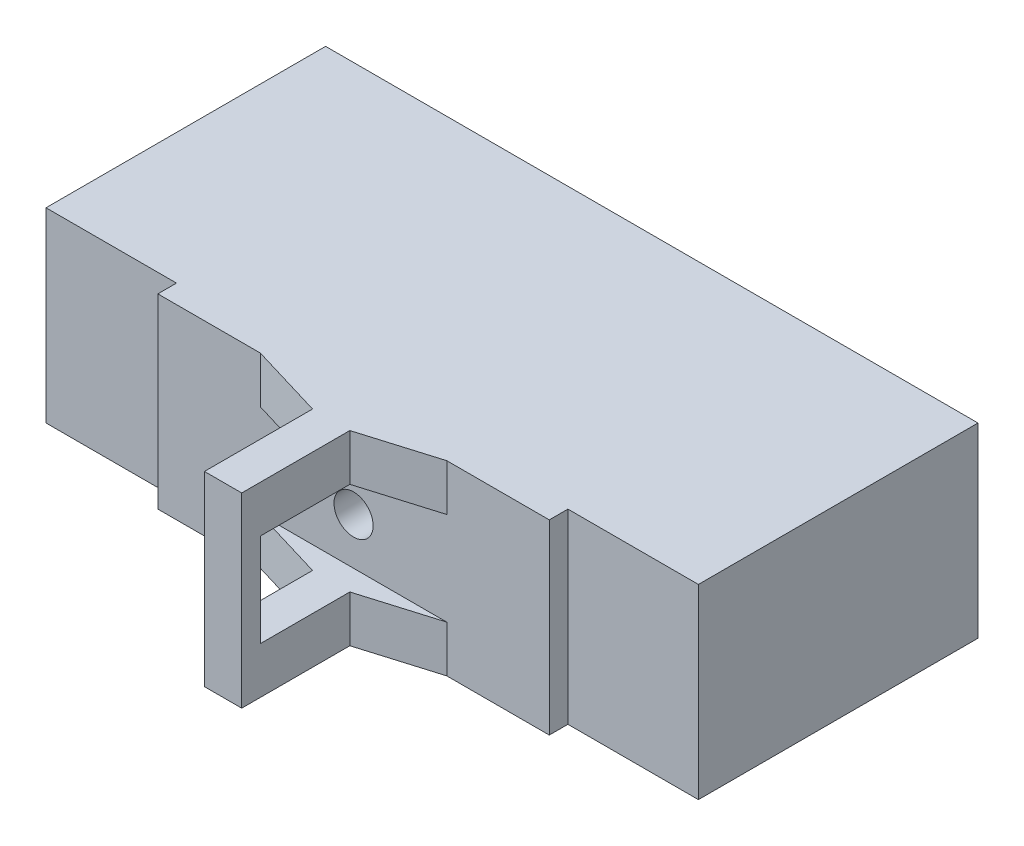
ISO-10303-21;
HEADER;
FILE_DESCRIPTION(('STEP AP214'),'2;1');
FILE_NAME('part.step','',(''),(''),'','','');
FILE_SCHEMA(('AUTOMOTIVE_DESIGN { 1 0 10303 214 1 1 1 1 }'));
ENDSEC;
DATA;
#1=APPLICATION_CONTEXT('core data for automotive mechanical design processes');
#2=APPLICATION_PROTOCOL_DEFINITION('international standard','automotive_design',2000,#1);
#3=PRODUCT_CONTEXT('',#1,'mechanical');
#4=PRODUCT('Part','Part','',(#3));
#5=PRODUCT_RELATED_PRODUCT_CATEGORY('part','',(#4));
#6=PRODUCT_DEFINITION_FORMATION('','',#4);
#7=PRODUCT_DEFINITION_CONTEXT('part definition',#1,'design');
#8=PRODUCT_DEFINITION('design','',#6,#7);
#9=PRODUCT_DEFINITION_SHAPE('','',#8);
#10=(LENGTH_UNIT() NAMED_UNIT(*) SI_UNIT(.MILLI.,.METRE.));
#11=(NAMED_UNIT(*) PLANE_ANGLE_UNIT() SI_UNIT($,.RADIAN.));
#12=(NAMED_UNIT(*) SI_UNIT($,.STERADIAN.) SOLID_ANGLE_UNIT());
#13=UNCERTAINTY_MEASURE_WITH_UNIT(LENGTH_MEASURE(1.E-05),#10,'distance_accuracy_value','');
#14=(GEOMETRIC_REPRESENTATION_CONTEXT(3) GLOBAL_UNCERTAINTY_ASSIGNED_CONTEXT((#13)) GLOBAL_UNIT_ASSIGNED_CONTEXT((#10,
#11,#12)) REPRESENTATION_CONTEXT('',''));
#15=CARTESIAN_POINT('',(0.,0.,0.));
#16=DIRECTION('',(0.,0.,1.));
#17=DIRECTION('',(1.,0.,0.));
#18=AXIS2_PLACEMENT_3D('',#15,#16,#17);
#19=CARTESIAN_POINT('',(31.,-4.44444444444445,44.));
#20=DIRECTION('',(0.,0.,1.));
#21=DIRECTION('',(1.,0.,0.));
#22=AXIS2_PLACEMENT_3D('',#19,#20,#21);
#23=PLANE('',#22);
#24=DIRECTION('',(-1.,0.,0.));
#25=VECTOR('',#24,1.);
#26=CARTESIAN_POINT('',(31.,-4.44444444444446,43.9999999999999));
#27=LINE('',#26,#25);
#28=CARTESIAN_POINT('',(8.00044444444444,-4.44444444444445,43.9999999999999));
#29=VERTEX_POINT('',#28);
#30=CARTESIAN_POINT('',(12.0004444444444,-4.44444444444445,43.9999999999999));
#31=VERTEX_POINT('',#30);
#32=EDGE_CURVE('E159',#29,#31,#27,.F.);
#33=ORIENTED_EDGE('',*,*,#32,.T.);
#34=DIRECTION('',(0.,1.,0.));
#35=VECTOR('',#34,1.);
#36=CARTESIAN_POINT('',(12.0004444444444,0.555555555555542,43.9999999999999));
#37=LINE('',#36,#35);
#38=CARTESIAN_POINT('',(12.0004444444444,-14.4444444444444,43.9999999999999));
#39=VERTEX_POINT('',#38);
#40=EDGE_CURVE('E162',#39,#31,#37,.T.);
#41=ORIENTED_EDGE('',*,*,#40,.F.);
#42=DIRECTION('',(1.,0.,0.));
#43=VECTOR('',#42,1.);
#44=CARTESIAN_POINT('',(31.,-14.4444444444444,43.9999999999999));
#45=LINE('',#44,#43);
#46=CARTESIAN_POINT('',(8.00044444444444,-14.4444444444444,43.9999999999999));
#47=VERTEX_POINT('',#46);
#48=EDGE_CURVE('E148',#39,#47,#45,.F.);
#49=ORIENTED_EDGE('',*,*,#48,.T.);
#50=DIRECTION('',(0.,1.,0.));
#51=VECTOR('',#50,1.);
#52=CARTESIAN_POINT('',(8.00044444444443,0.555555555555551,43.9999999999999));
#53=LINE('',#52,#51);
#54=EDGE_CURVE('E251',#29,#47,#53,.F.);
#55=ORIENTED_EDGE('',*,*,#54,.F.);
#56=EDGE_LOOP('',(#33,#41,#49,#55));
#57=FACE_BOUND('',#56,.T.);
#58=ADVANCED_FACE('F15',(#57),#23,.F.);
#59=CARTESIAN_POINT('',(31.,-14.4444444444444,44.));
#60=DIRECTION('',(0.,-1.,0.));
#61=DIRECTION('',(1.,0.,0.));
#62=AXIS2_PLACEMENT_3D('',#59,#60,#61);
#63=PLANE('',#62);
#64=DIRECTION('',(0.,0.,1.));
#65=VECTOR('',#64,1.);
#66=CARTESIAN_POINT('',(8.00044444444444,-14.4444444444444,32.));
#67=LINE('',#66,#65);
#68=CARTESIAN_POINT('',(8.00044444444444,-14.4444444444444,34.4001333333333));
#69=VERTEX_POINT('',#68);
#70=EDGE_CURVE('E155',#47,#69,#67,.F.);
#71=ORIENTED_EDGE('',*,*,#70,.F.);
#72=ORIENTED_EDGE('',*,*,#48,.F.);
#73=DIRECTION('',(0.,0.,-1.));
#74=VECTOR('',#73,1.);
#75=CARTESIAN_POINT('',(12.0004444444444,-14.4444444444444,46.));
#76=LINE('',#75,#74);
#77=CARTESIAN_POINT('',(12.0004444444444,-14.4444444444444,34.3998666666667));
#78=VERTEX_POINT('',#77);
#79=EDGE_CURVE('E152',#78,#39,#76,.F.);
#80=ORIENTED_EDGE('',*,*,#79,.F.);
#81=DIRECTION('',(0.957826285221152,0.,-0.287347885566345));
#82=VECTOR('',#81,1.);
#83=CARTESIAN_POINT('',(10.,-14.4444444444445,35.));
#84=LINE('',#83,#82);
#85=CARTESIAN_POINT('',(20.0000000000002,-14.4444444444444,32.));
#86=VERTEX_POINT('',#85);
#87=EDGE_CURVE('E172',#86,#78,#84,.F.);
#88=ORIENTED_EDGE('',*,*,#87,.F.);
#89=DIRECTION('',(1.,0.,0.));
#90=VECTOR('',#89,1.);
#91=CARTESIAN_POINT('',(10.,-14.4444444444444,32.));
#92=LINE('',#91,#90);
#93=CARTESIAN_POINT('',(-2.44484988277824E-13,-14.4444444444444,31.9999999999999));
#94=VERTEX_POINT('',#93);
#95=EDGE_CURVE('E240',#94,#86,#92,.T.);
#96=ORIENTED_EDGE('',*,*,#95,.F.);
#97=DIRECTION('',(0.957826285221152,0.,0.287347885566345));
#98=VECTOR('',#97,1.);
#99=CARTESIAN_POINT('',(0.,-14.4444444444444,32.));
#100=LINE('',#99,#98);
#101=EDGE_CURVE('E249',#69,#94,#100,.F.);
#102=ORIENTED_EDGE('',*,*,#101,.F.);
#103=EDGE_LOOP('',(#71,#72,#80,#88,#96,#102));
#104=FACE_BOUND('',#103,.T.);
#105=ADVANCED_FACE('F150',(#104),#63,.F.);
#106=CARTESIAN_POINT('',(10.,0.555555555555551,35.));
#107=DIRECTION('',(0.287347885566345,0.,0.957826285221152));
#108=DIRECTION('',(0.957826285221152,0.,-0.287347885566345));
#109=AXIS2_PLACEMENT_3D('',#106,#107,#108);
#110=PLANE('',#109);
#111=DIRECTION('',(0.957826285221151,0.,-0.287347885566348));
#112=VECTOR('',#111,1.);
#113=CARTESIAN_POINT('',(12.0004444444444,0.555555555555551,34.3998666666667));
#114=LINE('',#113,#112);
#115=CARTESIAN_POINT('',(12.0004444444444,0.555555555555551,34.3998666666667));
#116=VERTEX_POINT('',#115);
#117=CARTESIAN_POINT('',(20.,0.555555555555551,32.));
#118=VERTEX_POINT('',#117);
#119=EDGE_CURVE('E185',#116,#118,#114,.T.);
#120=ORIENTED_EDGE('',*,*,#119,.F.);
#121=DIRECTION('',(0.,1.,0.));
#122=VECTOR('',#121,1.);
#123=CARTESIAN_POINT('',(12.0004444444444,0.555555555555542,34.3998666666667));
#124=LINE('',#123,#122);
#125=CARTESIAN_POINT('',(12.0004444444444,-4.44444444444445,34.3998666666667));
#126=VERTEX_POINT('',#125);
#127=EDGE_CURVE('E274',#126,#116,#124,.T.);
#128=ORIENTED_EDGE('',*,*,#127,.F.);
#129=DIRECTION('',(0.957826285221152,0.,-0.287347885566344));
#130=VECTOR('',#129,1.);
#131=CARTESIAN_POINT('',(12.0004444444444,-4.44444444444445,34.3998666666667));
#132=LINE('',#131,#130);
#133=CARTESIAN_POINT('',(20.0000000000001,-4.44444444444445,32.));
#134=VERTEX_POINT('',#133);
#135=EDGE_CURVE('E191',#126,#134,#132,.T.);
#136=ORIENTED_EDGE('',*,*,#135,.T.);
#137=DIRECTION('',(0.,1.,0.));
#138=VECTOR('',#137,1.);
#139=CARTESIAN_POINT('',(20.,-9.44444444444445,32.));
#140=LINE('',#139,#138);
#141=EDGE_CURVE('E229',#118,#134,#140,.F.);
#142=ORIENTED_EDGE('',*,*,#141,.F.);
#143=EDGE_LOOP('',(#120,#128,#136,#142));
#144=FACE_BOUND('',#143,.T.);
#145=ADVANCED_FACE('F283',(#144),#110,.T.);
#146=CARTESIAN_POINT('',(31.,-4.44444444444446,32.));
#147=DIRECTION('',(0.,1.,0.));
#148=DIRECTION('',(-1.,0.,0.));
#149=AXIS2_PLACEMENT_3D('',#146,#147,#148);
#150=PLANE('',#149);
#151=DIRECTION('',(1.,0.,0.));
#152=VECTOR('',#151,1.);
#153=CARTESIAN_POINT('',(10.,-4.44444444444445,32.));
#154=LINE('',#153,#152);
#155=CARTESIAN_POINT('',(0.,-4.44444444444445,32.));
#156=VERTEX_POINT('',#155);
#157=EDGE_CURVE('E226',#134,#156,#154,.F.);
#158=ORIENTED_EDGE('',*,*,#157,.F.);
#159=ORIENTED_EDGE('',*,*,#135,.F.);
#160=DIRECTION('',(0.,0.,-1.));
#161=VECTOR('',#160,1.);
#162=CARTESIAN_POINT('',(12.0004444444444,-4.44444444444445,46.));
#163=LINE('',#162,#161);
#164=EDGE_CURVE('E166',#31,#126,#163,.T.);
#165=ORIENTED_EDGE('',*,*,#164,.F.);
#166=ORIENTED_EDGE('',*,*,#32,.F.);
#167=DIRECTION('',(0.,0.,1.));
#168=VECTOR('',#167,1.);
#169=CARTESIAN_POINT('',(8.00044444444444,-4.44444444444445,32.));
#170=LINE('',#169,#168);
#171=CARTESIAN_POINT('',(8.00044444444444,-4.44444444444445,34.4001333333333));
#172=VERTEX_POINT('',#171);
#173=EDGE_CURVE('E253',#172,#29,#170,.T.);
#174=ORIENTED_EDGE('',*,*,#173,.F.);
#175=DIRECTION('',(0.957826285221152,0.,0.287347885566345));
#176=VECTOR('',#175,1.);
#177=CARTESIAN_POINT('',(0.,-4.44444444444445,32.));
#178=LINE('',#177,#176);
#179=EDGE_CURVE('E189',#156,#172,#178,.T.);
#180=ORIENTED_EDGE('',*,*,#179,.F.);
#181=EDGE_LOOP('',(#158,#159,#165,#166,#174,#180));
#182=FACE_BOUND('',#181,.T.);
#183=ADVANCED_FACE('F279',(#182),#150,.F.);
#184=CARTESIAN_POINT('',(0.,0.555555555555551,32.));
#185=DIRECTION('',(-0.287347885566345,0.,0.957826285221152));
#186=DIRECTION('',(0.957826285221152,0.,0.287347885566345));
#187=AXIS2_PLACEMENT_3D('',#184,#185,#186);
#188=PLANE('',#187);
#189=DIRECTION('',(0.957826285221152,0.,0.287347885566343));
#190=VECTOR('',#189,1.);
#191=CARTESIAN_POINT('',(0.,0.555555555555551,32.));
#192=LINE('',#191,#190);
#193=CARTESIAN_POINT('',(0.,0.555555555555546,32.));
#194=VERTEX_POINT('',#193);
#195=CARTESIAN_POINT('',(8.00044444444444,0.555555555555547,34.4001333333333));
#196=VERTEX_POINT('',#195);
#197=EDGE_CURVE('E187',#194,#196,#192,.T.);
#198=ORIENTED_EDGE('',*,*,#197,.F.);
#199=DIRECTION('',(0.,1.,0.));
#200=VECTOR('',#199,1.);
#201=CARTESIAN_POINT('',(-3.38271077815477E-13,-9.44444444444445,32.));
#202=LINE('',#201,#200);
#203=EDGE_CURVE('E223',#156,#194,#202,.T.);
#204=ORIENTED_EDGE('',*,*,#203,.F.);
#205=ORIENTED_EDGE('',*,*,#179,.T.);
#206=DIRECTION('',(0.,1.,0.));
#207=VECTOR('',#206,1.);
#208=CARTESIAN_POINT('',(8.00044444444444,0.555555555555551,34.4001333333333));
#209=LINE('',#208,#207);
#210=EDGE_CURVE('E256',#196,#172,#209,.F.);
#211=ORIENTED_EDGE('',*,*,#210,.F.);
#212=EDGE_LOOP('',(#198,#204,#205,#211));
#213=FACE_BOUND('',#212,.T.);
#214=ADVANCED_FACE('F587',(#213),#188,.T.);
#215=CARTESIAN_POINT('',(10.,-9.44444444444445,0.));
#216=DIRECTION('',(0.,0.,1.));
#217=DIRECTION('',(0.,-1.,0.));
#218=AXIS2_PLACEMENT_3D('',#215,#216,#217);
#219=CYLINDRICAL_SURFACE('',#218,2.1);
#220=CARTESIAN_POINT('',(10.,-9.44444444444433,32.));
#221=DIRECTION('',(0.,0.,1.));
#222=DIRECTION('',(0.,-1.,0.));
#223=AXIS2_PLACEMENT_3D('',#220,#221,#222);
#224=CIRCLE('',#223,2.1);
#225=CARTESIAN_POINT('',(10.,-11.5444444444443,32.));
#226=VERTEX_POINT('',#225);
#227=EDGE_CURVE('E18',#226,#226,#224,.F.);
#228=ORIENTED_EDGE('',*,*,#227,.F.);
#229=EDGE_LOOP('',(#228));
#230=FACE_BOUND('',#229,.T.);
#231=CARTESIAN_POINT('',(10.,-9.44444444444445,0.));
#232=DIRECTION('',(0.,0.,1.));
#233=DIRECTION('',(0.,-1.,0.));
#234=AXIS2_PLACEMENT_3D('',#231,#232,#233);
#235=CIRCLE('',#234,2.1);
#236=CARTESIAN_POINT('',(10.,-11.5444444444445,0.));
#237=VERTEX_POINT('',#236);
#238=EDGE_CURVE('E193',#237,#237,#235,.F.);
#239=ORIENTED_EDGE('',*,*,#238,.T.);
#240=EDGE_LOOP('',(#239));
#241=FACE_BOUND('',#240,.T.);
#242=ADVANCED_FACE('F498',(#230,#241),#219,.F.);
#243=CARTESIAN_POINT('',(-25.,0.555555555555551,0.));
#244=DIRECTION('',(0.,1.,0.));
#245=DIRECTION('',(0.,0.,1.));
#246=AXIS2_PLACEMENT_3D('',#243,#244,#245);
#247=PLANE('',#246);
#248=DIRECTION('',(1.,0.,0.));
#249=VECTOR('',#248,1.);
#250=CARTESIAN_POINT('',(10.,0.55555555555555,0.));
#251=LINE('',#250,#249);
#252=CARTESIAN_POINT('',(45.,0.555555555555551,0.));
#253=VERTEX_POINT('',#252);
#254=CARTESIAN_POINT('',(-25.,0.555555555555551,0.));
#255=VERTEX_POINT('',#254);
#256=EDGE_CURVE('E195',#253,#255,#251,.F.);
#257=ORIENTED_EDGE('',*,*,#256,.T.);
#258=DIRECTION('',(0.,0.,1.));
#259=VECTOR('',#258,1.);
#260=CARTESIAN_POINT('',(-25.,0.555555555555552,0.));
#261=LINE('',#260,#259);
#262=CARTESIAN_POINT('',(-25.,0.555555555555551,30.));
#263=VERTEX_POINT('',#262);
#264=EDGE_CURVE('E196',#263,#255,#261,.F.);
#265=ORIENTED_EDGE('',*,*,#264,.F.);
#266=DIRECTION('',(1.,0.,0.));
#267=VECTOR('',#266,1.);
#268=CARTESIAN_POINT('',(10.,0.55555555555555,30.));
#269=LINE('',#268,#267);
#270=CARTESIAN_POINT('',(-11.,0.555555555555551,30.));
#271=VERTEX_POINT('',#270);
#272=EDGE_CURVE('E208',#271,#263,#269,.F.);
#273=ORIENTED_EDGE('',*,*,#272,.F.);
#274=DIRECTION('',(0.,0.,1.));
#275=VECTOR('',#274,1.);
#276=CARTESIAN_POINT('',(-11.,0.555555555555552,30.));
#277=LINE('',#276,#275);
#278=CARTESIAN_POINT('',(-11.,0.555555555555551,32.));
#279=VERTEX_POINT('',#278);
#280=EDGE_CURVE('E216',#279,#271,#277,.F.);
#281=ORIENTED_EDGE('',*,*,#280,.F.);
#282=DIRECTION('',(1.,0.,0.));
#283=VECTOR('',#282,1.);
#284=CARTESIAN_POINT('',(10.,0.55555555555555,32.));
#285=LINE('',#284,#283);
#286=EDGE_CURVE('E221',#194,#279,#285,.F.);
#287=ORIENTED_EDGE('',*,*,#286,.F.);
#288=ORIENTED_EDGE('',*,*,#197,.T.);
#289=DIRECTION('',(0.,0.,1.));
#290=VECTOR('',#289,1.);
#291=CARTESIAN_POINT('',(8.00044444444444,0.555555555555542,32.));
#292=LINE('',#291,#290);
#293=CARTESIAN_POINT('',(8.00044444444444,0.555555555555544,46.));
#294=VERTEX_POINT('',#293);
#295=EDGE_CURVE('E259',#294,#196,#292,.F.);
#296=ORIENTED_EDGE('',*,*,#295,.F.);
#297=DIRECTION('',(1.,0.,0.));
#298=VECTOR('',#297,1.);
#299=CARTESIAN_POINT('',(8.00044444444444,0.555555555555542,46.));
#300=LINE('',#299,#298);
#301=CARTESIAN_POINT('',(12.0004444444444,0.555555555555549,46.));
#302=VERTEX_POINT('',#301);
#303=EDGE_CURVE('E266',#302,#294,#300,.F.);
#304=ORIENTED_EDGE('',*,*,#303,.F.);
#305=DIRECTION('',(0.,0.,-1.));
#306=VECTOR('',#305,1.);
#307=CARTESIAN_POINT('',(12.0004444444444,0.555555555555551,46.));
#308=LINE('',#307,#306);
#309=EDGE_CURVE('E272',#116,#302,#308,.F.);
#310=ORIENTED_EDGE('',*,*,#309,.F.);
#311=ORIENTED_EDGE('',*,*,#119,.T.);
#312=DIRECTION('',(1.,0.,0.));
#313=VECTOR('',#312,1.);
#314=CARTESIAN_POINT('',(10.,0.55555555555555,32.));
#315=LINE('',#314,#313);
#316=CARTESIAN_POINT('',(31.,0.555555555555551,32.));
#317=VERTEX_POINT('',#316);
#318=EDGE_CURVE('E232',#317,#118,#315,.F.);
#319=ORIENTED_EDGE('',*,*,#318,.F.);
#320=DIRECTION('',(0.,0.,-1.));
#321=VECTOR('',#320,1.);
#322=CARTESIAN_POINT('',(31.,0.555555555555551,30.));
#323=LINE('',#322,#321);
#324=CARTESIAN_POINT('',(31.,0.555555555555551,30.));
#325=VERTEX_POINT('',#324);
#326=EDGE_CURVE('E174',#325,#317,#323,.F.);
#327=ORIENTED_EDGE('',*,*,#326,.F.);
#328=DIRECTION('',(1.,0.,0.));
#329=VECTOR('',#328,1.);
#330=CARTESIAN_POINT('',(10.,0.55555555555555,30.));
#331=LINE('',#330,#329);
#332=CARTESIAN_POINT('',(45.,0.555555555555551,30.));
#333=VERTEX_POINT('',#332);
#334=EDGE_CURVE('E182',#333,#325,#331,.F.);
#335=ORIENTED_EDGE('',*,*,#334,.F.);
#336=DIRECTION('',(0.,0.,-1.));
#337=VECTOR('',#336,1.);
#338=CARTESIAN_POINT('',(45.,0.555555555555551,0.));
#339=LINE('',#338,#337);
#340=EDGE_CURVE('E320',#253,#333,#339,.F.);
#341=ORIENTED_EDGE('',*,*,#340,.F.);
#342=EDGE_LOOP('',(#257,#265,#273,#281,#287,#288,#296,#304,#310,#311,#319,#327,#335,#341));
#343=FACE_BOUND('',#342,.T.);
#344=ADVANCED_FACE('F288',(#343),#247,.T.);
#345=CARTESIAN_POINT('',(10.,-9.44444444444445,30.));
#346=DIRECTION('',(0.,0.,1.));
#347=DIRECTION('',(1.,0.,0.));
#348=AXIS2_PLACEMENT_3D('',#345,#346,#347);
#349=PLANE('',#348);
#350=DIRECTION('',(0.,1.,0.));
#351=VECTOR('',#350,1.);
#352=CARTESIAN_POINT('',(45.,0.555555555555551,30.));
#353=LINE('',#352,#351);
#354=CARTESIAN_POINT('',(45.,-19.4444444444444,30.));
#355=VERTEX_POINT('',#354);
#356=EDGE_CURVE('E324',#333,#355,#353,.F.);
#357=ORIENTED_EDGE('',*,*,#356,.F.);
#358=ORIENTED_EDGE('',*,*,#334,.T.);
#359=DIRECTION('',(0.,1.,0.));
#360=VECTOR('',#359,1.);
#361=CARTESIAN_POINT('',(31.,0.555555555555551,30.));
#362=LINE('',#361,#360);
#363=CARTESIAN_POINT('',(31.,-19.4444444444444,30.));
#364=VERTEX_POINT('',#363);
#365=EDGE_CURVE('E179',#364,#325,#362,.T.);
#366=ORIENTED_EDGE('',*,*,#365,.F.);
#367=DIRECTION('',(1.,0.,0.));
#368=VECTOR('',#367,1.);
#369=CARTESIAN_POINT('',(45.,-19.4444444444445,30.));
#370=LINE('',#369,#368);
#371=EDGE_CURVE('E317',#355,#364,#370,.F.);
#372=ORIENTED_EDGE('',*,*,#371,.F.);
#373=EDGE_LOOP('',(#357,#358,#366,#372));
#374=FACE_BOUND('',#373,.T.);
#375=ADVANCED_FACE('F371',(#374),#349,.T.);
#376=CARTESIAN_POINT('',(31.,0.555555555555551,30.));
#377=DIRECTION('',(1.,0.,0.));
#378=DIRECTION('',(0.,0.,-1.));
#379=AXIS2_PLACEMENT_3D('',#376,#377,#378);
#380=PLANE('',#379);
#381=ORIENTED_EDGE('',*,*,#365,.T.);
#382=ORIENTED_EDGE('',*,*,#326,.T.);
#383=DIRECTION('',(0.,1.,0.));
#384=VECTOR('',#383,1.);
#385=CARTESIAN_POINT('',(31.,-9.44444444444445,32.));
#386=LINE('',#385,#384);
#387=CARTESIAN_POINT('',(31.,-19.4444444444444,32.));
#388=VERTEX_POINT('',#387);
#389=EDGE_CURVE('E235',#388,#317,#386,.T.);
#390=ORIENTED_EDGE('',*,*,#389,.F.);
#391=DIRECTION('',(0.,0.,-1.));
#392=VECTOR('',#391,1.);
#393=CARTESIAN_POINT('',(31.,-19.4444444444445,0.));
#394=LINE('',#393,#392);
#395=EDGE_CURVE('E314',#364,#388,#394,.F.);
#396=ORIENTED_EDGE('',*,*,#395,.F.);
#397=EDGE_LOOP('',(#381,#382,#390,#396));
#398=FACE_BOUND('',#397,.T.);
#399=ADVANCED_FACE('F373',(#398),#380,.T.);
#400=CARTESIAN_POINT('',(10.,0.555555555555551,35.));
#401=DIRECTION('',(0.287347885566345,0.,0.957826285221152));
#402=DIRECTION('',(0.957826285221152,0.,-0.287347885566345));
#403=AXIS2_PLACEMENT_3D('',#400,#401,#402);
#404=PLANE('',#403);
#405=DIRECTION('',(-0.957826285221151,0.,0.287347885566348));
#406=VECTOR('',#405,1.);
#407=CARTESIAN_POINT('',(20.,-19.4444444444445,32.));
#408=LINE('',#407,#406);
#409=CARTESIAN_POINT('',(20.0000000000001,-19.4444444444445,32.));
#410=VERTEX_POINT('',#409);
#411=CARTESIAN_POINT('',(12.0004444444444,-19.4444444444445,34.3998666666667));
#412=VERTEX_POINT('',#411);
#413=EDGE_CURVE('E307',#410,#412,#408,.T.);
#414=ORIENTED_EDGE('',*,*,#413,.F.);
#415=DIRECTION('',(0.,1.,0.));
#416=VECTOR('',#415,1.);
#417=CARTESIAN_POINT('',(20.0000000000001,-9.44444444444445,32.));
#418=LINE('',#417,#416);
#419=EDGE_CURVE('E238',#86,#410,#418,.F.);
#420=ORIENTED_EDGE('',*,*,#419,.F.);
#421=ORIENTED_EDGE('',*,*,#87,.T.);
#422=DIRECTION('',(0.,1.,0.));
#423=VECTOR('',#422,1.);
#424=CARTESIAN_POINT('',(12.0004444444444,0.555555555555542,34.3998666666667));
#425=LINE('',#424,#423);
#426=EDGE_CURVE('E171',#412,#78,#425,.T.);
#427=ORIENTED_EDGE('',*,*,#426,.F.);
#428=EDGE_LOOP('',(#414,#420,#421,#427));
#429=FACE_BOUND('',#428,.T.);
#430=ADVANCED_FACE('F377',(#429),#404,.T.);
#431=CARTESIAN_POINT('',(12.0004444444444,0.555555555555542,46.));
#432=DIRECTION('',(1.,0.,0.));
#433=DIRECTION('',(0.,0.,-1.));
#434=AXIS2_PLACEMENT_3D('',#431,#432,#433);
#435=PLANE('',#434);
#436=DIRECTION('',(0.,0.,-1.));
#437=VECTOR('',#436,1.);
#438=CARTESIAN_POINT('',(12.0004444444444,-19.4444444444445,0.));
#439=LINE('',#438,#437);
#440=CARTESIAN_POINT('',(12.0004444444444,-19.4444444444445,46.));
#441=VERTEX_POINT('',#440);
#442=EDGE_CURVE('E292',#412,#441,#439,.F.);
#443=ORIENTED_EDGE('',*,*,#442,.F.);
#444=ORIENTED_EDGE('',*,*,#426,.T.);
#445=ORIENTED_EDGE('',*,*,#79,.T.);
#446=ORIENTED_EDGE('',*,*,#40,.T.);
#447=ORIENTED_EDGE('',*,*,#164,.T.);
#448=ORIENTED_EDGE('',*,*,#127,.T.);
#449=ORIENTED_EDGE('',*,*,#309,.T.);
#450=DIRECTION('',(0.,-1.,0.));
#451=VECTOR('',#450,1.);
#452=CARTESIAN_POINT('',(12.0004444444444,0.555555555555542,46.));
#453=LINE('',#452,#451);
#454=EDGE_CURVE('E268',#441,#302,#453,.F.);
#455=ORIENTED_EDGE('',*,*,#454,.F.);
#456=EDGE_LOOP('',(#443,#444,#445,#446,#447,#448,#449,#455));
#457=FACE_BOUND('',#456,.T.);
#458=ADVANCED_FACE('F170',(#457),#435,.T.);
#459=CARTESIAN_POINT('',(8.00044444444444,0.555555555555542,46.));
#460=DIRECTION('',(0.,0.,1.));
#461=DIRECTION('',(0.,-1.,0.));
#462=AXIS2_PLACEMENT_3D('',#459,#460,#461);
#463=PLANE('',#462);
#464=ORIENTED_EDGE('',*,*,#303,.T.);
#465=DIRECTION('',(0.,1.,0.));
#466=VECTOR('',#465,1.);
#467=CARTESIAN_POINT('',(8.00044444444443,0.555555555555551,46.));
#468=LINE('',#467,#466);
#469=CARTESIAN_POINT('',(8.00044444444444,-19.4444444444445,46.));
#470=VERTEX_POINT('',#469);
#471=EDGE_CURVE('E262',#470,#294,#468,.T.);
#472=ORIENTED_EDGE('',*,*,#471,.F.);
#473=DIRECTION('',(1.,0.,0.));
#474=VECTOR('',#473,1.);
#475=CARTESIAN_POINT('',(45.,-19.4444444444445,46.));
#476=LINE('',#475,#474);
#477=EDGE_CURVE('E296',#441,#470,#476,.F.);
#478=ORIENTED_EDGE('',*,*,#477,.F.);
#479=ORIENTED_EDGE('',*,*,#454,.T.);
#480=EDGE_LOOP('',(#464,#472,#478,#479));
#481=FACE_BOUND('',#480,.T.);
#482=ADVANCED_FACE('F297',(#481),#463,.T.);
#483=CARTESIAN_POINT('',(8.00044444444444,0.555555555555551,32.));
#484=DIRECTION('',(-1.,0.,0.));
#485=DIRECTION('',(0.,0.,1.));
#486=AXIS2_PLACEMENT_3D('',#483,#484,#485);
#487=PLANE('',#486);
#488=ORIENTED_EDGE('',*,*,#173,.T.);
#489=ORIENTED_EDGE('',*,*,#54,.T.);
#490=ORIENTED_EDGE('',*,*,#70,.T.);
#491=DIRECTION('',(0.,1.,0.));
#492=VECTOR('',#491,1.);
#493=CARTESIAN_POINT('',(8.00044444444444,0.555555555555551,34.4001333333333));
#494=LINE('',#493,#492);
#495=CARTESIAN_POINT('',(8.00044444444444,-19.4444444444445,34.4001333333333));
#496=VERTEX_POINT('',#495);
#497=EDGE_CURVE('E246',#496,#69,#494,.T.);
#498=ORIENTED_EDGE('',*,*,#497,.F.);
#499=DIRECTION('',(0.,0.,-1.));
#500=VECTOR('',#499,1.);
#501=CARTESIAN_POINT('',(8.00044444444445,-19.4444444444445,0.));
#502=LINE('',#501,#500);
#503=EDGE_CURVE('E301',#470,#496,#502,.T.);
#504=ORIENTED_EDGE('',*,*,#503,.F.);
#505=ORIENTED_EDGE('',*,*,#471,.T.);
#506=ORIENTED_EDGE('',*,*,#295,.T.);
#507=ORIENTED_EDGE('',*,*,#210,.T.);
#508=EDGE_LOOP('',(#488,#489,#490,#498,#504,#505,#506,#507));
#509=FACE_BOUND('',#508,.T.);
#510=ADVANCED_FACE('F349',(#509),#487,.T.);
#511=CARTESIAN_POINT('',(0.,0.555555555555551,32.));
#512=DIRECTION('',(-0.287347885566345,0.,0.957826285221152));
#513=DIRECTION('',(0.957826285221152,0.,0.287347885566345));
#514=AXIS2_PLACEMENT_3D('',#511,#512,#513);
#515=PLANE('',#514);
#516=DIRECTION('',(-0.957826285221152,0.,-0.287347885566343));
#517=VECTOR('',#516,1.);
#518=CARTESIAN_POINT('',(8.00044444444445,-19.4444444444445,34.4001333333333));
#519=LINE('',#518,#517);
#520=CARTESIAN_POINT('',(-1.66956222055457E-13,-19.4444444444445,31.9999999999999));
#521=VERTEX_POINT('',#520);
#522=EDGE_CURVE('E345',#496,#521,#519,.T.);
#523=ORIENTED_EDGE('',*,*,#522,.F.);
#524=ORIENTED_EDGE('',*,*,#497,.T.);
#525=ORIENTED_EDGE('',*,*,#101,.T.);
#526=DIRECTION('',(0.,1.,0.));
#527=VECTOR('',#526,1.);
#528=CARTESIAN_POINT('',(0.,-9.44444444444445,32.));
#529=LINE('',#528,#527);
#530=EDGE_CURVE('E243',#521,#94,#529,.T.);
#531=ORIENTED_EDGE('',*,*,#530,.F.);
#532=EDGE_LOOP('',(#523,#524,#525,#531));
#533=FACE_BOUND('',#532,.T.);
#534=ADVANCED_FACE('F351',(#533),#515,.T.);
#535=CARTESIAN_POINT('',(10.,-9.44444444444445,32.));
#536=DIRECTION('',(0.,0.,1.));
#537=DIRECTION('',(1.,0.,0.));
#538=AXIS2_PLACEMENT_3D('',#535,#536,#537);
#539=PLANE('',#538);
#540=ORIENTED_EDGE('',*,*,#203,.T.);
#541=ORIENTED_EDGE('',*,*,#286,.T.);
#542=DIRECTION('',(0.,1.,0.));
#543=VECTOR('',#542,1.);
#544=CARTESIAN_POINT('',(-11.,-19.4444444444444,32.));
#545=LINE('',#544,#543);
#546=CARTESIAN_POINT('',(-11.,-19.4444444444444,32.));
#547=VERTEX_POINT('',#546);
#548=EDGE_CURVE('E218',#547,#279,#545,.T.);
#549=ORIENTED_EDGE('',*,*,#548,.F.);
#550=DIRECTION('',(1.,0.,0.));
#551=VECTOR('',#550,1.);
#552=CARTESIAN_POINT('',(45.,-19.4444444444445,32.));
#553=LINE('',#552,#551);
#554=EDGE_CURVE('E342',#521,#547,#553,.F.);
#555=ORIENTED_EDGE('',*,*,#554,.F.);
#556=ORIENTED_EDGE('',*,*,#530,.T.);
#557=ORIENTED_EDGE('',*,*,#95,.T.);
#558=ORIENTED_EDGE('',*,*,#419,.T.);
#559=DIRECTION('',(1.,0.,0.));
#560=VECTOR('',#559,1.);
#561=CARTESIAN_POINT('',(45.,-19.4444444444445,32.));
#562=LINE('',#561,#560);
#563=EDGE_CURVE('E309',#388,#410,#562,.F.);
#564=ORIENTED_EDGE('',*,*,#563,.F.);
#565=ORIENTED_EDGE('',*,*,#389,.T.);
#566=ORIENTED_EDGE('',*,*,#318,.T.);
#567=ORIENTED_EDGE('',*,*,#141,.T.);
#568=ORIENTED_EDGE('',*,*,#157,.T.);
#569=EDGE_LOOP('',(#540,#541,#549,#555,#556,#557,#558,#564,#565,#566,#567,#568));
#570=FACE_BOUND('',#569,.T.);
#571=ORIENTED_EDGE('',*,*,#227,.T.);
#572=EDGE_LOOP('',(#571));
#573=FACE_BOUND('',#572,.T.);
#574=ADVANCED_FACE('F355',(#570,#573),#539,.T.);
#575=CARTESIAN_POINT('',(-11.,-19.4444444444444,30.));
#576=DIRECTION('',(-1.,0.,0.));
#577=DIRECTION('',(0.,0.,1.));
#578=AXIS2_PLACEMENT_3D('',#575,#576,#577);
#579=PLANE('',#578);
#580=DIRECTION('',(0.,1.,0.));
#581=VECTOR('',#580,1.);
#582=CARTESIAN_POINT('',(-11.,-9.44444444444445,30.));
#583=LINE('',#582,#581);
#584=CARTESIAN_POINT('',(-11.,-19.4444444444444,30.));
#585=VERTEX_POINT('',#584);
#586=EDGE_CURVE('E213',#585,#271,#583,.T.);
#587=ORIENTED_EDGE('',*,*,#586,.F.);
#588=DIRECTION('',(0.,0.,-1.));
#589=VECTOR('',#588,1.);
#590=CARTESIAN_POINT('',(-11.,-19.4444444444445,0.));
#591=LINE('',#590,#589);
#592=EDGE_CURVE('E338',#547,#585,#591,.T.);
#593=ORIENTED_EDGE('',*,*,#592,.F.);
#594=ORIENTED_EDGE('',*,*,#548,.T.);
#595=ORIENTED_EDGE('',*,*,#280,.T.);
#596=EDGE_LOOP('',(#587,#593,#594,#595));
#597=FACE_BOUND('',#596,.T.);
#598=ADVANCED_FACE('F359',(#597),#579,.T.);
#599=CARTESIAN_POINT('',(10.,-9.44444444444445,30.));
#600=DIRECTION('',(0.,0.,1.));
#601=DIRECTION('',(1.,0.,0.));
#602=AXIS2_PLACEMENT_3D('',#599,#600,#601);
#603=PLANE('',#602);
#604=DIRECTION('',(0.,1.,0.));
#605=VECTOR('',#604,1.);
#606=CARTESIAN_POINT('',(-25.,-19.4444444444445,30.));
#607=LINE('',#606,#605);
#608=CARTESIAN_POINT('',(-25.,-19.4444444444445,30.));
#609=VERTEX_POINT('',#608);
#610=EDGE_CURVE('E202',#609,#263,#607,.T.);
#611=ORIENTED_EDGE('',*,*,#610,.F.);
#612=DIRECTION('',(1.,0.,0.));
#613=VECTOR('',#612,1.);
#614=CARTESIAN_POINT('',(45.,-19.4444444444445,30.));
#615=LINE('',#614,#613);
#616=EDGE_CURVE('E336',#585,#609,#615,.F.);
#617=ORIENTED_EDGE('',*,*,#616,.F.);
#618=ORIENTED_EDGE('',*,*,#586,.T.);
#619=ORIENTED_EDGE('',*,*,#272,.T.);
#620=EDGE_LOOP('',(#611,#617,#618,#619));
#621=FACE_BOUND('',#620,.T.);
#622=ADVANCED_FACE('F363',(#621),#603,.T.);
#623=CARTESIAN_POINT('',(-25.,-19.4444444444445,0.));
#624=DIRECTION('',(-1.,0.,0.));
#625=DIRECTION('',(0.,0.,1.));
#626=AXIS2_PLACEMENT_3D('',#623,#624,#625);
#627=PLANE('',#626);
#628=DIRECTION('',(0.,1.,0.));
#629=VECTOR('',#628,1.);
#630=CARTESIAN_POINT('',(-25.,-9.44444444444445,0.));
#631=LINE('',#630,#629);
#632=CARTESIAN_POINT('',(-25.,-19.4444444444445,0.));
#633=VERTEX_POINT('',#632);
#634=EDGE_CURVE('E199',#255,#633,#631,.F.);
#635=ORIENTED_EDGE('',*,*,#634,.T.);
#636=DIRECTION('',(0.,0.,-1.));
#637=VECTOR('',#636,1.);
#638=CARTESIAN_POINT('',(-25.,-19.4444444444445,0.));
#639=LINE('',#638,#637);
#640=EDGE_CURVE('E329',#609,#633,#639,.T.);
#641=ORIENTED_EDGE('',*,*,#640,.F.);
#642=ORIENTED_EDGE('',*,*,#610,.T.);
#643=ORIENTED_EDGE('',*,*,#264,.T.);
#644=EDGE_LOOP('',(#635,#641,#642,#643));
#645=FACE_BOUND('',#644,.T.);
#646=ADVANCED_FACE('F327',(#645),#627,.T.);
#647=CARTESIAN_POINT('',(10.,-9.44444444444445,0.));
#648=DIRECTION('',(0.,0.,1.));
#649=DIRECTION('',(1.,0.,0.));
#650=AXIS2_PLACEMENT_3D('',#647,#648,#649);
#651=PLANE('',#650);
#652=ORIENTED_EDGE('',*,*,#634,.F.);
#653=ORIENTED_EDGE('',*,*,#256,.F.);
#654=DIRECTION('',(0.,1.,0.));
#655=VECTOR('',#654,1.);
#656=CARTESIAN_POINT('',(45.,0.555555555555551,0.));
#657=LINE('',#656,#655);
#658=CARTESIAN_POINT('',(45.,-19.4444444444445,0.));
#659=VERTEX_POINT('',#658);
#660=EDGE_CURVE('E33',#659,#253,#657,.T.);
#661=ORIENTED_EDGE('',*,*,#660,.F.);
#662=DIRECTION('',(1.,0.,0.));
#663=VECTOR('',#662,1.);
#664=CARTESIAN_POINT('',(45.,-19.4444444444445,0.));
#665=LINE('',#664,#663);
#666=EDGE_CURVE('E24',#633,#659,#665,.T.);
#667=ORIENTED_EDGE('',*,*,#666,.F.);
#668=EDGE_LOOP('',(#652,#653,#661,#667));
#669=FACE_BOUND('',#668,.T.);
#670=ORIENTED_EDGE('',*,*,#238,.F.);
#671=EDGE_LOOP('',(#670));
#672=FACE_BOUND('',#671,.T.);
#673=ADVANCED_FACE('F331',(#669,#672),#651,.F.);
#674=CARTESIAN_POINT('',(45.,0.555555555555551,0.));
#675=DIRECTION('',(1.,0.,0.));
#676=DIRECTION('',(0.,0.,-1.));
#677=AXIS2_PLACEMENT_3D('',#674,#675,#676);
#678=PLANE('',#677);
#679=ORIENTED_EDGE('',*,*,#660,.T.);
#680=ORIENTED_EDGE('',*,*,#340,.T.);
#681=ORIENTED_EDGE('',*,*,#356,.T.);
#682=DIRECTION('',(0.,0.,-1.));
#683=VECTOR('',#682,1.);
#684=CARTESIAN_POINT('',(45.,-19.4444444444445,0.));
#685=LINE('',#684,#683);
#686=EDGE_CURVE('E10',#659,#355,#685,.F.);
#687=ORIENTED_EDGE('',*,*,#686,.F.);
#688=EDGE_LOOP('',(#679,#680,#681,#687));
#689=FACE_BOUND('',#688,.T.);
#690=ADVANCED_FACE('F368',(#689),#678,.T.);
#691=CARTESIAN_POINT('',(45.,-19.4444444444445,0.));
#692=DIRECTION('',(0.,-1.,0.));
#693=DIRECTION('',(0.,0.,-1.));
#694=AXIS2_PLACEMENT_3D('',#691,#692,#693);
#695=PLANE('',#694);
#696=ORIENTED_EDGE('',*,*,#666,.T.);
#697=ORIENTED_EDGE('',*,*,#686,.T.);
#698=ORIENTED_EDGE('',*,*,#371,.T.);
#699=ORIENTED_EDGE('',*,*,#395,.T.);
#700=ORIENTED_EDGE('',*,*,#563,.T.);
#701=ORIENTED_EDGE('',*,*,#413,.T.);
#702=ORIENTED_EDGE('',*,*,#442,.T.);
#703=ORIENTED_EDGE('',*,*,#477,.T.);
#704=ORIENTED_EDGE('',*,*,#503,.T.);
#705=ORIENTED_EDGE('',*,*,#522,.T.);
#706=ORIENTED_EDGE('',*,*,#554,.T.);
#707=ORIENTED_EDGE('',*,*,#592,.T.);
#708=ORIENTED_EDGE('',*,*,#616,.T.);
#709=ORIENTED_EDGE('',*,*,#640,.T.);
#710=EDGE_LOOP('',(#696,#697,#698,#699,#700,#701,#702,#703,#704,#705,#706,#707,#708,#709));
#711=FACE_BOUND('',#710,.T.);
#712=ADVANCED_FACE('F304',(#711),#695,.T.);
#713=CLOSED_SHELL('',(#58,#105,#145,#183,#214,#242,#344,#375,#399,#430,#458,#482,#510,#534,#574,
#598,#622,#646,#673,#690,#712));
#714=MANIFOLD_SOLID_BREP('B1',#713);
#715=ADVANCED_BREP_SHAPE_REPRESENTATION('',(#18,#714),#14);
#716=SHAPE_DEFINITION_REPRESENTATION(#9,#715);
ENDSEC;
END-ISO-10303-21;
